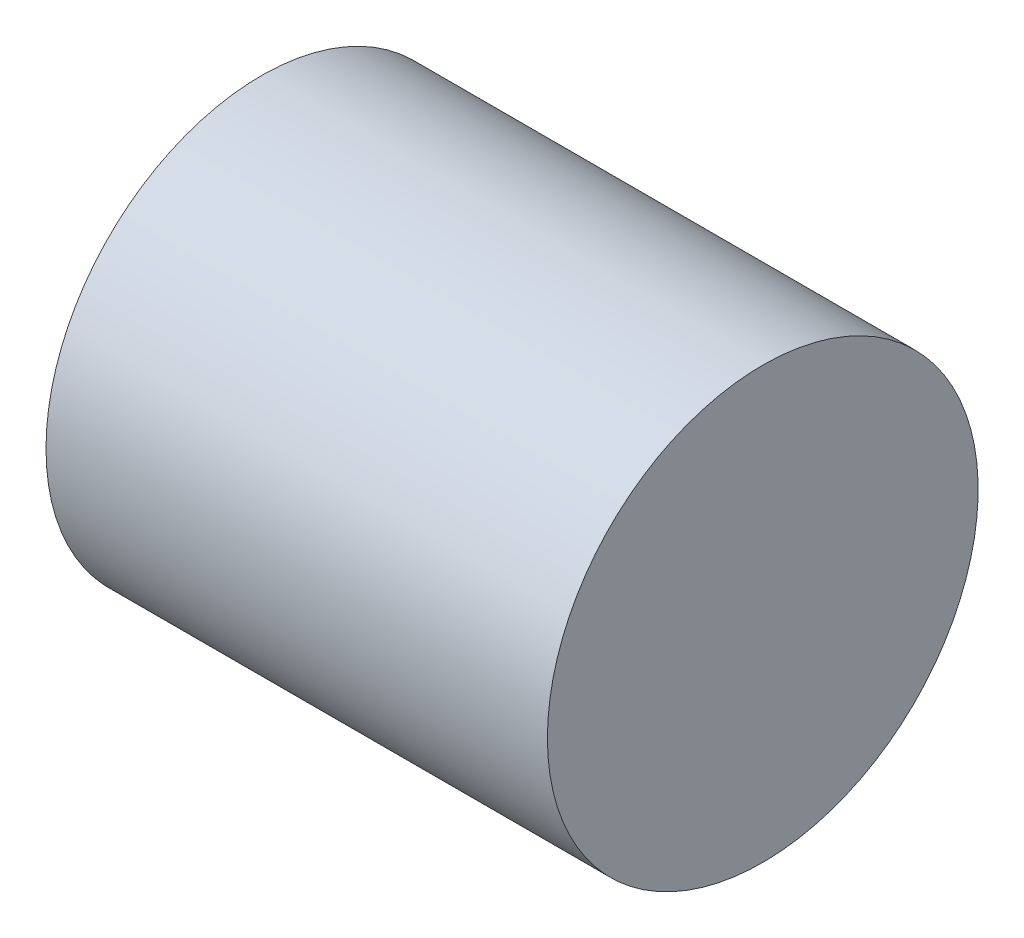
ISO-10303-21;
HEADER;
FILE_DESCRIPTION(('STEP AP214'),'2;1');
FILE_NAME('part.step','',(''),(''),'','','');
FILE_SCHEMA(('AUTOMOTIVE_DESIGN { 1 0 10303 214 1 1 1 1 }'));
ENDSEC;
DATA;
#1=APPLICATION_CONTEXT('core data for automotive mechanical design processes');
#2=APPLICATION_PROTOCOL_DEFINITION('international standard','automotive_design',2000,#1);
#3=PRODUCT_CONTEXT('',#1,'mechanical');
#4=PRODUCT('Part','Part','',(#3));
#5=PRODUCT_RELATED_PRODUCT_CATEGORY('part','',(#4));
#6=PRODUCT_DEFINITION_FORMATION('','',#4);
#7=PRODUCT_DEFINITION_CONTEXT('part definition',#1,'design');
#8=PRODUCT_DEFINITION('design','',#6,#7);
#9=PRODUCT_DEFINITION_SHAPE('','',#8);
#10=(LENGTH_UNIT() NAMED_UNIT(*) SI_UNIT(.MILLI.,.METRE.));
#11=(NAMED_UNIT(*) PLANE_ANGLE_UNIT() SI_UNIT($,.RADIAN.));
#12=(NAMED_UNIT(*) SI_UNIT($,.STERADIAN.) SOLID_ANGLE_UNIT());
#13=UNCERTAINTY_MEASURE_WITH_UNIT(LENGTH_MEASURE(1.E-05),#10,'distance_accuracy_value','');
#14=(GEOMETRIC_REPRESENTATION_CONTEXT(3) GLOBAL_UNCERTAINTY_ASSIGNED_CONTEXT((#13)) GLOBAL_UNIT_ASSIGNED_CONTEXT((#10,
#11,#12)) REPRESENTATION_CONTEXT('',''));
#15=CARTESIAN_POINT('',(0.,0.,0.));
#16=DIRECTION('',(0.,0.,1.));
#17=DIRECTION('',(1.,0.,0.));
#18=AXIS2_PLACEMENT_3D('',#15,#16,#17);
#19=CARTESIAN_POINT('',(0.,0.,0.));
#20=DIRECTION('',(1.,0.,0.));
#21=DIRECTION('',(0.,0.,-1.));
#22=AXIS2_PLACEMENT_3D('',#19,#20,#21);
#23=PLANE('',#22);
#24=CARTESIAN_POINT('',(0.,0.,0.));
#25=DIRECTION('',(1.,0.,0.));
#26=DIRECTION('',(0.,0.,-1.));
#27=AXIS2_PLACEMENT_3D('',#24,#25,#26);
#28=CIRCLE('',#27,4.7625);
#29=CARTESIAN_POINT('',(0.,0.,-4.7625));
#30=VERTEX_POINT('',#29);
#31=EDGE_CURVE('E45',#30,#30,#28,.F.);
#32=ORIENTED_EDGE('',*,*,#31,.F.);
#33=EDGE_LOOP('',(#32));
#34=FACE_BOUND('',#33,.T.);
#35=CARTESIAN_POINT('',(0.,0.,0.));
#36=DIRECTION('',(-1.,0.,0.));
#37=DIRECTION('',(0.,0.,1.));
#38=AXIS2_PLACEMENT_3D('',#35,#36,#37);
#39=CIRCLE('',#38,9.45);
#40=CARTESIAN_POINT('',(0.,0.,9.45));
#41=VERTEX_POINT('',#40);
#42=EDGE_CURVE('E10',#41,#41,#39,.T.);
#43=ORIENTED_EDGE('',*,*,#42,.T.);
#44=EDGE_LOOP('',(#43));
#45=FACE_BOUND('',#44,.T.);
#46=ADVANCED_FACE('F39',(#34,#45),#23,.F.);
#47=CARTESIAN_POINT('',(-1000.,0.,0.));
#48=DIRECTION('',(-1.,0.,0.));
#49=DIRECTION('',(0.,0.,1.));
#50=AXIS2_PLACEMENT_3D('',#47,#48,#49);
#51=CYLINDRICAL_SURFACE('',#50,9.45);
#52=ORIENTED_EDGE('',*,*,#42,.F.);
#53=EDGE_LOOP('',(#52));
#54=FACE_BOUND('',#53,.T.);
#55=CARTESIAN_POINT('',(22.,0.,0.));
#56=DIRECTION('',(-1.,0.,0.));
#57=DIRECTION('',(0.,0.,1.));
#58=AXIS2_PLACEMENT_3D('',#55,#56,#57);
#59=CIRCLE('',#58,9.45);
#60=CARTESIAN_POINT('',(22.,0.,9.45));
#61=VERTEX_POINT('',#60);
#62=EDGE_CURVE('E46',#61,#61,#59,.T.);
#63=ORIENTED_EDGE('',*,*,#62,.T.);
#64=EDGE_LOOP('',(#63));
#65=FACE_BOUND('',#64,.T.);
#66=ADVANCED_FACE('F61',(#54,#65),#51,.T.);
#67=CARTESIAN_POINT('',(22.,9.45,0.));
#68=DIRECTION('',(-1.,0.,0.));
#69=DIRECTION('',(0.,0.,1.));
#70=AXIS2_PLACEMENT_3D('',#67,#68,#69);
#71=PLANE('',#70);
#72=ORIENTED_EDGE('',*,*,#62,.F.);
#73=EDGE_LOOP('',(#72));
#74=FACE_BOUND('',#73,.T.);
#75=ADVANCED_FACE('F70',(#74),#71,.F.);
#76=CARTESIAN_POINT('',(-1000.,0.,0.));
#77=DIRECTION('',(-1.,0.,0.));
#78=DIRECTION('',(0.,0.,1.));
#79=AXIS2_PLACEMENT_3D('',#76,#77,#78);
#80=CYLINDRICAL_SURFACE('',#79,4.7625);
#81=CARTESIAN_POINT('',(16.7999999999999,0.,0.));
#82=DIRECTION('',(-1.,0.,0.));
#83=DIRECTION('',(0.,0.,1.));
#84=AXIS2_PLACEMENT_3D('',#81,#82,#83);
#85=CIRCLE('',#84,4.7625);
#86=CARTESIAN_POINT('',(16.7999999999999,0.,4.7625));
#87=VERTEX_POINT('',#86);
#88=EDGE_CURVE('E55',#87,#87,#85,.T.);
#89=ORIENTED_EDGE('',*,*,#88,.F.);
#90=EDGE_LOOP('',(#89));
#91=FACE_BOUND('',#90,.T.);
#92=ORIENTED_EDGE('',*,*,#31,.T.);
#93=EDGE_LOOP('',(#92));
#94=FACE_BOUND('',#93,.T.);
#95=ADVANCED_FACE('F56',(#91,#94),#80,.F.);
#96=CARTESIAN_POINT('',(16.8,4.7625,0.));
#97=DIRECTION('',(-1.,0.,0.));
#98=DIRECTION('',(0.,0.,1.));
#99=AXIS2_PLACEMENT_3D('',#96,#97,#98);
#100=PLANE('',#99);
#101=ORIENTED_EDGE('',*,*,#88,.T.);
#102=EDGE_LOOP('',(#101));
#103=FACE_BOUND('',#102,.T.);
#104=ADVANCED_FACE('F76',(#103),#100,.T.);
#105=CLOSED_SHELL('',(#46,#66,#75,#95,#104));
#106=MANIFOLD_SOLID_BREP('B2',#105);
#107=ADVANCED_BREP_SHAPE_REPRESENTATION('',(#18,#106),#14);
#108=SHAPE_DEFINITION_REPRESENTATION(#9,#107);
ENDSEC;
END-ISO-10303-21;
